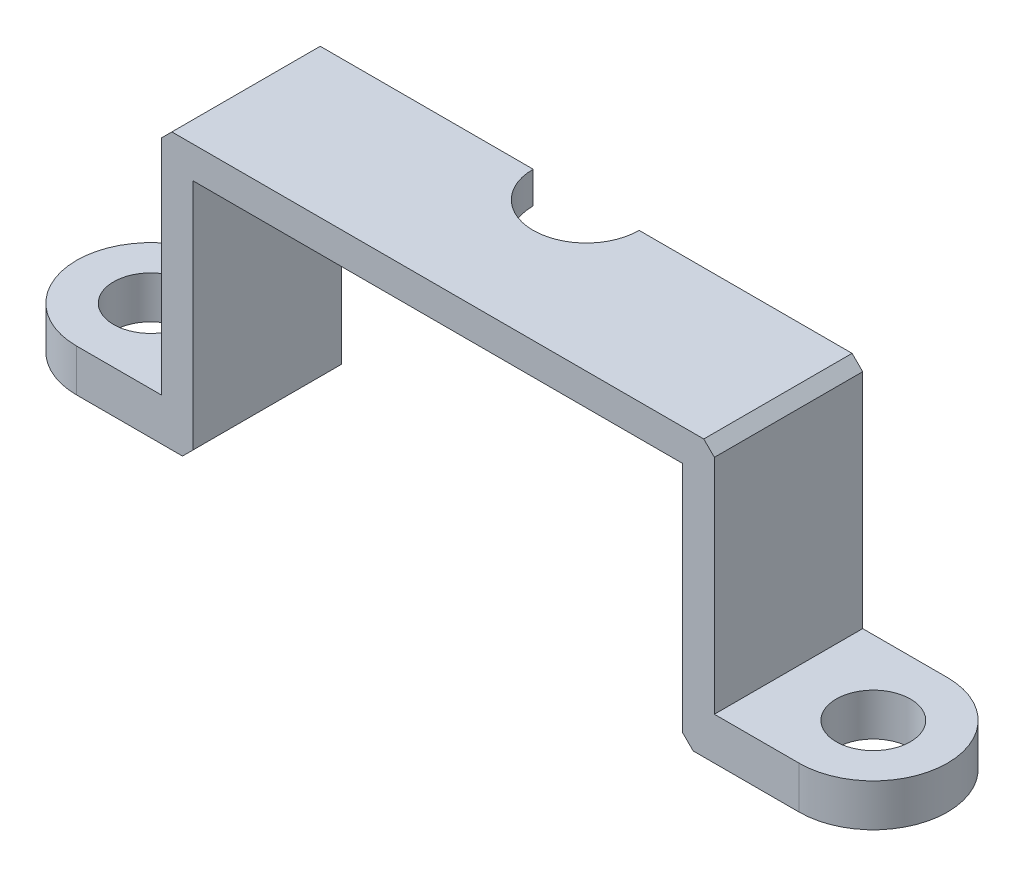
ISO-10303-21;
HEADER;
FILE_DESCRIPTION(('STEP AP214'),'2;1');
FILE_NAME('part.step','',(''),(''),'','','');
FILE_SCHEMA(('AUTOMOTIVE_DESIGN { 1 0 10303 214 1 1 1 1 }'));
ENDSEC;
DATA;
#1=APPLICATION_CONTEXT('core data for automotive mechanical design processes');
#2=APPLICATION_PROTOCOL_DEFINITION('international standard','automotive_design',2000,#1);
#3=PRODUCT_CONTEXT('',#1,'mechanical');
#4=PRODUCT('Part','Part','',(#3));
#5=PRODUCT_RELATED_PRODUCT_CATEGORY('part','',(#4));
#6=PRODUCT_DEFINITION_FORMATION('','',#4);
#7=PRODUCT_DEFINITION_CONTEXT('part definition',#1,'design');
#8=PRODUCT_DEFINITION('design','',#6,#7);
#9=PRODUCT_DEFINITION_SHAPE('','',#8);
#10=(LENGTH_UNIT() NAMED_UNIT(*) SI_UNIT(.MILLI.,.METRE.));
#11=(NAMED_UNIT(*) PLANE_ANGLE_UNIT() SI_UNIT($,.RADIAN.));
#12=(NAMED_UNIT(*) SI_UNIT($,.STERADIAN.) SOLID_ANGLE_UNIT());
#13=UNCERTAINTY_MEASURE_WITH_UNIT(LENGTH_MEASURE(1.E-05),#10,'distance_accuracy_value','');
#14=(GEOMETRIC_REPRESENTATION_CONTEXT(3) GLOBAL_UNCERTAINTY_ASSIGNED_CONTEXT((#13)) GLOBAL_UNIT_ASSIGNED_CONTEXT((#10,
#11,#12)) REPRESENTATION_CONTEXT('',''));
#15=CARTESIAN_POINT('',(0.,0.,0.));
#16=DIRECTION('',(0.,0.,1.));
#17=DIRECTION('',(1.,0.,0.));
#18=AXIS2_PLACEMENT_3D('',#15,#16,#17);
#19=CARTESIAN_POINT('',(0.,0.,0.));
#20=DIRECTION('',(0.,0.,1.));
#21=DIRECTION('',(1.,0.,0.));
#22=AXIS2_PLACEMENT_3D('',#19,#20,#21);
#23=PLANE('',#22);
#24=DIRECTION('',(1.,0.,0.));
#25=VECTOR('',#24,1.);
#26=CARTESIAN_POINT('',(0.,11.5,0.));
#27=LINE('',#26,#25);
#28=CARTESIAN_POINT('',(2.5,11.5,0.));
#29=VERTEX_POINT('',#28);
#30=CARTESIAN_POINT('',(11.55,11.5,0.));
#31=VERTEX_POINT('',#30);
#32=EDGE_CURVE('E175',#29,#31,#27,.T.);
#33=ORIENTED_EDGE('',*,*,#32,.F.);
#34=DIRECTION('',(0.,1.,0.));
#35=VECTOR('',#34,1.);
#36=CARTESIAN_POINT('',(2.5,0.,0.));
#37=LINE('',#36,#35);
#38=CARTESIAN_POINT('',(2.5,13.,0.));
#39=VERTEX_POINT('',#38);
#40=EDGE_CURVE('E11',#29,#39,#37,.T.);
#41=ORIENTED_EDGE('',*,*,#40,.T.);
#42=DIRECTION('',(-1.,0.,0.));
#43=VECTOR('',#42,1.);
#44=CARTESIAN_POINT('',(13.05,13.,0.));
#45=LINE('',#44,#43);
#46=CARTESIAN_POINT('',(12.55,13.,0.));
#47=VERTEX_POINT('',#46);
#48=EDGE_CURVE('E173',#47,#39,#45,.T.);
#49=ORIENTED_EDGE('',*,*,#48,.F.);
#50=DIRECTION('',(-0.707106781186546,0.707106781186549,0.));
#51=VECTOR('',#50,1.);
#52=CARTESIAN_POINT('',(12.55,13.,0.));
#53=LINE('',#52,#51);
#54=CARTESIAN_POINT('',(13.05,12.5,0.));
#55=VERTEX_POINT('',#54);
#56=EDGE_CURVE('E204',#47,#55,#53,.F.);
#57=ORIENTED_EDGE('',*,*,#56,.T.);
#58=DIRECTION('',(0.,1.,0.));
#59=VECTOR('',#58,1.);
#60=CARTESIAN_POINT('',(13.05,2.,0.));
#61=LINE('',#60,#59);
#62=CARTESIAN_POINT('',(13.05,2.,0.));
#63=VERTEX_POINT('',#62);
#64=EDGE_CURVE('E185',#63,#55,#61,.T.);
#65=ORIENTED_EDGE('',*,*,#64,.F.);
#66=DIRECTION('',(-1.,0.,0.));
#67=VECTOR('',#66,1.);
#68=CARTESIAN_POINT('',(21.05,2.,0.));
#69=LINE('',#68,#67);
#70=CARTESIAN_POINT('',(17.05,2.,0.));
#71=VERTEX_POINT('',#70);
#72=EDGE_CURVE('E295',#71,#63,#69,.T.);
#73=ORIENTED_EDGE('',*,*,#72,.F.);
#74=DIRECTION('',(0.,1.,0.));
#75=VECTOR('',#74,1.);
#76=CARTESIAN_POINT('',(17.05,0.,0.));
#77=LINE('',#76,#75);
#78=CARTESIAN_POINT('',(17.05,0.,0.));
#79=VERTEX_POINT('',#78);
#80=EDGE_CURVE('E246',#79,#71,#77,.T.);
#81=ORIENTED_EDGE('',*,*,#80,.F.);
#82=DIRECTION('',(1.,0.,0.));
#83=VECTOR('',#82,1.);
#84=CARTESIAN_POINT('',(11.55,0.,0.));
#85=LINE('',#84,#83);
#86=CARTESIAN_POINT('',(12.05,0.,0.));
#87=VERTEX_POINT('',#86);
#88=EDGE_CURVE('E280',#87,#79,#85,.T.);
#89=ORIENTED_EDGE('',*,*,#88,.F.);
#90=DIRECTION('',(0.707106781186545,-0.70710678118655,0.));
#91=VECTOR('',#90,1.);
#92=CARTESIAN_POINT('',(12.05,0.,0.));
#93=LINE('',#92,#91);
#94=CARTESIAN_POINT('',(11.55,0.5,0.));
#95=VERTEX_POINT('',#94);
#96=EDGE_CURVE('E202',#87,#95,#93,.F.);
#97=ORIENTED_EDGE('',*,*,#96,.T.);
#98=DIRECTION('',(0.,-1.,0.));
#99=VECTOR('',#98,1.);
#100=CARTESIAN_POINT('',(11.55,11.5,0.));
#101=LINE('',#100,#99);
#102=EDGE_CURVE('E190',#31,#95,#101,.T.);
#103=ORIENTED_EDGE('',*,*,#102,.F.);
#104=EDGE_LOOP('',(#33,#41,#49,#57,#65,#73,#81,#89,#97,#103));
#105=FACE_BOUND('',#104,.T.);
#106=ADVANCED_FACE('F38',(#105),#23,.F.);
#107=CARTESIAN_POINT('',(11.55,0.,7.));
#108=DIRECTION('',(0.,1.,0.));
#109=DIRECTION('',(0.,0.,1.));
#110=AXIS2_PLACEMENT_3D('',#107,#108,#109);
#111=PLANE('',#110);
#112=CARTESIAN_POINT('',(17.05,0.,3.5));
#113=DIRECTION('',(0.,1.,0.));
#114=DIRECTION('',(-1.,0.,0.));
#115=AXIS2_PLACEMENT_3D('',#112,#113,#114);
#116=CIRCLE('',#115,1.75);
#117=CARTESIAN_POINT('',(15.3,0.,3.5));
#118=VERTEX_POINT('',#117);
#119=EDGE_CURVE('E277',#118,#118,#116,.T.);
#120=ORIENTED_EDGE('',*,*,#119,.T.);
#121=EDGE_LOOP('',(#120));
#122=FACE_BOUND('',#121,.T.);
#123=DIRECTION('',(1.,0.,0.));
#124=VECTOR('',#123,1.);
#125=CARTESIAN_POINT('',(11.55,0.,7.));
#126=LINE('',#125,#124);
#127=CARTESIAN_POINT('',(12.05,0.,7.));
#128=VERTEX_POINT('',#127);
#129=CARTESIAN_POINT('',(17.05,0.,7.));
#130=VERTEX_POINT('',#129);
#131=EDGE_CURVE('E193',#128,#130,#126,.T.);
#132=ORIENTED_EDGE('',*,*,#131,.F.);
#133=DIRECTION('',(0.,0.,-1.));
#134=VECTOR('',#133,1.);
#135=CARTESIAN_POINT('',(12.05,0.,7.));
#136=LINE('',#135,#134);
#137=EDGE_CURVE('E212',#128,#87,#136,.T.);
#138=ORIENTED_EDGE('',*,*,#137,.T.);
#139=ORIENTED_EDGE('',*,*,#88,.T.);
#140=CARTESIAN_POINT('',(17.05,0.,3.5));
#141=DIRECTION('',(0.,-1.,0.));
#142=DIRECTION('',(-1.,0.,0.));
#143=AXIS2_PLACEMENT_3D('',#140,#141,#142);
#144=CIRCLE('',#143,3.5);
#145=EDGE_CURVE('E270',#79,#130,#144,.T.);
#146=ORIENTED_EDGE('',*,*,#145,.T.);
#147=EDGE_LOOP('',(#132,#138,#139,#146));
#148=FACE_BOUND('',#147,.T.);
#149=ADVANCED_FACE('F364',(#122,#148),#111,.F.);
#150=CARTESIAN_POINT('',(21.05,2.,7.));
#151=DIRECTION('',(0.,-1.,0.));
#152=DIRECTION('',(1.,0.,0.));
#153=AXIS2_PLACEMENT_3D('',#150,#151,#152);
#154=PLANE('',#153);
#155=CARTESIAN_POINT('',(17.05,2.,3.5));
#156=DIRECTION('',(0.,1.,0.));
#157=DIRECTION('',(-1.,0.,0.));
#158=AXIS2_PLACEMENT_3D('',#155,#156,#157);
#159=CIRCLE('',#158,1.75);
#160=CARTESIAN_POINT('',(15.3,2.,3.5));
#161=VERTEX_POINT('',#160);
#162=EDGE_CURVE('E274',#161,#161,#159,.T.);
#163=ORIENTED_EDGE('',*,*,#162,.F.);
#164=EDGE_LOOP('',(#163));
#165=FACE_BOUND('',#164,.T.);
#166=DIRECTION('',(-1.,0.,0.));
#167=VECTOR('',#166,1.);
#168=CARTESIAN_POINT('',(21.05,2.,7.));
#169=LINE('',#168,#167);
#170=CARTESIAN_POINT('',(17.05,2.,7.));
#171=VERTEX_POINT('',#170);
#172=CARTESIAN_POINT('',(13.05,2.,7.));
#173=VERTEX_POINT('',#172);
#174=EDGE_CURVE('E284',#171,#173,#169,.T.);
#175=ORIENTED_EDGE('',*,*,#174,.F.);
#176=CARTESIAN_POINT('',(17.05,2.,3.5));
#177=DIRECTION('',(0.,-1.,0.));
#178=DIRECTION('',(-1.,0.,0.));
#179=AXIS2_PLACEMENT_3D('',#176,#177,#178);
#180=CIRCLE('',#179,3.5);
#181=EDGE_CURVE('E272',#71,#171,#180,.T.);
#182=ORIENTED_EDGE('',*,*,#181,.F.);
#183=ORIENTED_EDGE('',*,*,#72,.T.);
#184=DIRECTION('',(0.,0.,-1.));
#185=VECTOR('',#184,1.);
#186=CARTESIAN_POINT('',(13.05,2.,7.));
#187=LINE('',#186,#185);
#188=EDGE_CURVE('E197',#173,#63,#187,.T.);
#189=ORIENTED_EDGE('',*,*,#188,.F.);
#190=EDGE_LOOP('',(#175,#182,#183,#189));
#191=FACE_BOUND('',#190,.T.);
#192=ADVANCED_FACE('F369',(#165,#191),#154,.F.);
#193=CARTESIAN_POINT('',(13.05,2.,7.));
#194=DIRECTION('',(-1.,0.,0.));
#195=DIRECTION('',(0.,0.,1.));
#196=AXIS2_PLACEMENT_3D('',#193,#194,#195);
#197=PLANE('',#196);
#198=ORIENTED_EDGE('',*,*,#64,.T.);
#199=DIRECTION('',(0.,0.,1.));
#200=VECTOR('',#199,1.);
#201=CARTESIAN_POINT('',(13.05,12.5,7.));
#202=LINE('',#201,#200);
#203=CARTESIAN_POINT('',(13.05,12.5,7.));
#204=VERTEX_POINT('',#203);
#205=EDGE_CURVE('E206',#55,#204,#202,.T.);
#206=ORIENTED_EDGE('',*,*,#205,.T.);
#207=DIRECTION('',(0.,1.,0.));
#208=VECTOR('',#207,1.);
#209=CARTESIAN_POINT('',(13.05,2.,7.));
#210=LINE('',#209,#208);
#211=EDGE_CURVE('E286',#173,#204,#210,.T.);
#212=ORIENTED_EDGE('',*,*,#211,.F.);
#213=ORIENTED_EDGE('',*,*,#188,.T.);
#214=EDGE_LOOP('',(#198,#206,#212,#213));
#215=FACE_BOUND('',#214,.T.);
#216=ADVANCED_FACE('F304',(#215),#197,.F.);
#217=CARTESIAN_POINT('',(13.05,13.,7.));
#218=DIRECTION('',(0.,-1.,0.));
#219=DIRECTION('',(1.,0.,0.));
#220=AXIS2_PLACEMENT_3D('',#217,#218,#219);
#221=PLANE('',#220);
#222=ORIENTED_EDGE('',*,*,#48,.T.);
#223=CARTESIAN_POINT('',(0.,13.,0.));
#224=DIRECTION('',(0.,1.,0.));
#225=DIRECTION('',(-1.,0.,0.));
#226=AXIS2_PLACEMENT_3D('',#223,#224,#225);
#227=CIRCLE('',#226,2.5);
#228=CARTESIAN_POINT('',(-2.5,13.,0.));
#229=VERTEX_POINT('',#228);
#230=EDGE_CURVE('E164',#229,#39,#227,.T.);
#231=ORIENTED_EDGE('',*,*,#230,.F.);
#232=CARTESIAN_POINT('',(-12.55,13.,0.));
#233=VERTEX_POINT('',#232);
#234=EDGE_CURVE('E181',#229,#233,#45,.T.);
#235=ORIENTED_EDGE('',*,*,#234,.T.);
#236=DIRECTION('',(0.,0.,1.));
#237=VECTOR('',#236,1.);
#238=CARTESIAN_POINT('',(-12.55,13.,7.));
#239=LINE('',#238,#237);
#240=CARTESIAN_POINT('',(-12.55,13.,7.));
#241=VERTEX_POINT('',#240);
#242=EDGE_CURVE('E225',#233,#241,#239,.T.);
#243=ORIENTED_EDGE('',*,*,#242,.T.);
#244=DIRECTION('',(-1.,0.,0.));
#245=VECTOR('',#244,1.);
#246=CARTESIAN_POINT('',(13.05,13.,7.));
#247=LINE('',#246,#245);
#248=CARTESIAN_POINT('',(12.55,13.,7.));
#249=VERTEX_POINT('',#248);
#250=EDGE_CURVE('E289',#249,#241,#247,.T.);
#251=ORIENTED_EDGE('',*,*,#250,.F.);
#252=DIRECTION('',(0.,0.,-1.));
#253=VECTOR('',#252,1.);
#254=CARTESIAN_POINT('',(12.55,13.,7.));
#255=LINE('',#254,#253);
#256=EDGE_CURVE('E180',#249,#47,#255,.T.);
#257=ORIENTED_EDGE('',*,*,#256,.T.);
#258=EDGE_LOOP('',(#222,#231,#235,#243,#251,#257));
#259=FACE_BOUND('',#258,.T.);
#260=ADVANCED_FACE('F177',(#259),#221,.F.);
#261=CARTESIAN_POINT('',(0.,11.5,7.));
#262=DIRECTION('',(0.,1.,0.));
#263=DIRECTION('',(0.,0.,1.));
#264=AXIS2_PLACEMENT_3D('',#261,#262,#263);
#265=PLANE('',#264);
#266=CARTESIAN_POINT('',(-11.55,11.5,0.));
#267=VERTEX_POINT('',#266);
#268=CARTESIAN_POINT('',(-2.5,11.5,0.));
#269=VERTEX_POINT('',#268);
#270=EDGE_CURVE('E183',#267,#269,#27,.T.);
#271=ORIENTED_EDGE('',*,*,#270,.T.);
#272=CARTESIAN_POINT('',(0.,11.5,0.));
#273=DIRECTION('',(0.,1.,0.));
#274=DIRECTION('',(0.,0.,1.));
#275=AXIS2_PLACEMENT_3D('',#272,#273,#274);
#276=CIRCLE('',#275,2.5);
#277=EDGE_CURVE('E54',#269,#29,#276,.T.);
#278=ORIENTED_EDGE('',*,*,#277,.T.);
#279=ORIENTED_EDGE('',*,*,#32,.T.);
#280=DIRECTION('',(0.,0.,-1.));
#281=VECTOR('',#280,1.);
#282=CARTESIAN_POINT('',(11.55,11.5,7.));
#283=LINE('',#282,#281);
#284=CARTESIAN_POINT('',(11.55,11.5,7.));
#285=VERTEX_POINT('',#284);
#286=EDGE_CURVE('E194',#285,#31,#283,.T.);
#287=ORIENTED_EDGE('',*,*,#286,.F.);
#288=DIRECTION('',(1.,0.,0.));
#289=VECTOR('',#288,1.);
#290=CARTESIAN_POINT('',(0.,11.5,7.));
#291=LINE('',#290,#289);
#292=CARTESIAN_POINT('',(-11.55,11.5,7.));
#293=VERTEX_POINT('',#292);
#294=EDGE_CURVE('E244',#293,#285,#291,.T.);
#295=ORIENTED_EDGE('',*,*,#294,.F.);
#296=DIRECTION('',(0.,0.,-1.));
#297=VECTOR('',#296,1.);
#298=CARTESIAN_POINT('',(-11.55,11.5,7.));
#299=LINE('',#298,#297);
#300=EDGE_CURVE('E241',#293,#267,#299,.T.);
#301=ORIENTED_EDGE('',*,*,#300,.T.);
#302=EDGE_LOOP('',(#271,#278,#279,#287,#295,#301));
#303=FACE_BOUND('',#302,.T.);
#304=ADVANCED_FACE('F239',(#303),#265,.F.);
#305=CARTESIAN_POINT('',(11.55,11.5,7.));
#306=DIRECTION('',(1.,0.,0.));
#307=DIRECTION('',(0.,1.,0.));
#308=AXIS2_PLACEMENT_3D('',#305,#306,#307);
#309=PLANE('',#308);
#310=ORIENTED_EDGE('',*,*,#102,.T.);
#311=DIRECTION('',(0.,0.,1.));
#312=VECTOR('',#311,1.);
#313=CARTESIAN_POINT('',(11.55,0.5,7.));
#314=LINE('',#313,#312);
#315=CARTESIAN_POINT('',(11.55,0.5,7.));
#316=VERTEX_POINT('',#315);
#317=EDGE_CURVE('E215',#95,#316,#314,.T.);
#318=ORIENTED_EDGE('',*,*,#317,.T.);
#319=DIRECTION('',(0.,-1.,0.));
#320=VECTOR('',#319,1.);
#321=CARTESIAN_POINT('',(11.55,11.5,7.));
#322=LINE('',#321,#320);
#323=EDGE_CURVE('E198',#285,#316,#322,.T.);
#324=ORIENTED_EDGE('',*,*,#323,.F.);
#325=ORIENTED_EDGE('',*,*,#286,.T.);
#326=EDGE_LOOP('',(#310,#318,#324,#325));
#327=FACE_BOUND('',#326,.T.);
#328=ADVANCED_FACE('F383',(#327),#309,.F.);
#329=CARTESIAN_POINT('',(0.,0.,7.));
#330=DIRECTION('',(0.,0.,1.));
#331=DIRECTION('',(1.,0.,0.));
#332=AXIS2_PLACEMENT_3D('',#329,#330,#331);
#333=PLANE('',#332);
#334=ORIENTED_EDGE('',*,*,#250,.T.);
#335=DIRECTION('',(-0.707106781186546,-0.707106781186549,0.));
#336=VECTOR('',#335,1.);
#337=CARTESIAN_POINT('',(-12.775,12.775,7.));
#338=LINE('',#337,#336);
#339=CARTESIAN_POINT('',(-13.05,12.5,7.));
#340=VERTEX_POINT('',#339);
#341=EDGE_CURVE('E228',#241,#340,#338,.T.);
#342=ORIENTED_EDGE('',*,*,#341,.T.);
#343=DIRECTION('',(0.,1.,0.));
#344=VECTOR('',#343,1.);
#345=CARTESIAN_POINT('',(-13.05,2.,7.));
#346=LINE('',#345,#344);
#347=CARTESIAN_POINT('',(-13.05,2.,7.));
#348=VERTEX_POINT('',#347);
#349=EDGE_CURVE('E318',#348,#340,#346,.T.);
#350=ORIENTED_EDGE('',*,*,#349,.F.);
#351=DIRECTION('',(1.,0.,0.));
#352=VECTOR('',#351,1.);
#353=CARTESIAN_POINT('',(-21.05,2.,7.));
#354=LINE('',#353,#352);
#355=CARTESIAN_POINT('',(-17.05,2.,7.));
#356=VERTEX_POINT('',#355);
#357=EDGE_CURVE('E265',#356,#348,#354,.T.);
#358=ORIENTED_EDGE('',*,*,#357,.F.);
#359=DIRECTION('',(0.,1.,0.));
#360=VECTOR('',#359,1.);
#361=CARTESIAN_POINT('',(-17.05,0.,7.));
#362=LINE('',#361,#360);
#363=CARTESIAN_POINT('',(-17.05,0.,7.));
#364=VERTEX_POINT('',#363);
#365=EDGE_CURVE('E331',#364,#356,#362,.T.);
#366=ORIENTED_EDGE('',*,*,#365,.F.);
#367=DIRECTION('',(-1.,0.,0.));
#368=VECTOR('',#367,1.);
#369=CARTESIAN_POINT('',(-11.55,0.,7.));
#370=LINE('',#369,#368);
#371=CARTESIAN_POINT('',(-12.05,0.,7.));
#372=VERTEX_POINT('',#371);
#373=EDGE_CURVE('E263',#372,#364,#370,.T.);
#374=ORIENTED_EDGE('',*,*,#373,.F.);
#375=DIRECTION('',(-0.707106781186545,-0.70710678118655,0.));
#376=VECTOR('',#375,1.);
#377=CARTESIAN_POINT('',(-6.02500000000004,6.025,7.));
#378=LINE('',#377,#376);
#379=CARTESIAN_POINT('',(-11.55,0.500000000000004,7.));
#380=VERTEX_POINT('',#379);
#381=EDGE_CURVE('E62',#372,#380,#378,.F.);
#382=ORIENTED_EDGE('',*,*,#381,.T.);
#383=DIRECTION('',(0.,-1.,0.));
#384=VECTOR('',#383,1.);
#385=CARTESIAN_POINT('',(-11.55,11.5,7.));
#386=LINE('',#385,#384);
#387=EDGE_CURVE('E323',#293,#380,#386,.T.);
#388=ORIENTED_EDGE('',*,*,#387,.F.);
#389=ORIENTED_EDGE('',*,*,#294,.T.);
#390=ORIENTED_EDGE('',*,*,#323,.T.);
#391=DIRECTION('',(-0.707106781186545,0.70710678118655,0.));
#392=VECTOR('',#391,1.);
#393=CARTESIAN_POINT('',(6.02500000000004,6.025,7.));
#394=LINE('',#393,#392);
#395=EDGE_CURVE('E208',#316,#128,#394,.F.);
#396=ORIENTED_EDGE('',*,*,#395,.T.);
#397=ORIENTED_EDGE('',*,*,#131,.T.);
#398=DIRECTION('',(0.,1.,0.));
#399=VECTOR('',#398,1.);
#400=CARTESIAN_POINT('',(17.05,0.,7.));
#401=LINE('',#400,#399);
#402=EDGE_CURVE('E267',#130,#171,#401,.T.);
#403=ORIENTED_EDGE('',*,*,#402,.T.);
#404=ORIENTED_EDGE('',*,*,#174,.T.);
#405=ORIENTED_EDGE('',*,*,#211,.T.);
#406=DIRECTION('',(0.707106781186546,-0.707106781186549,0.));
#407=VECTOR('',#406,1.);
#408=CARTESIAN_POINT('',(12.775,12.775,7.));
#409=LINE('',#408,#407);
#410=EDGE_CURVE('E210',#204,#249,#409,.F.);
#411=ORIENTED_EDGE('',*,*,#410,.T.);
#412=EDGE_LOOP('',(#334,#342,#350,#358,#366,#374,#382,#388,#389,#390,#396,#397,#403,#404,#405,#411));
#413=FACE_BOUND('',#412,.T.);
#414=ADVANCED_FACE('F309',(#413),#333,.T.);
#415=ORIENTED_EDGE('',*,*,#234,.F.);
#416=DIRECTION('',(0.,1.,0.));
#417=VECTOR('',#416,1.);
#418=CARTESIAN_POINT('',(-2.5,0.,0.));
#419=LINE('',#418,#417);
#420=EDGE_CURVE('E47',#229,#269,#419,.F.);
#421=ORIENTED_EDGE('',*,*,#420,.T.);
#422=ORIENTED_EDGE('',*,*,#270,.F.);
#423=DIRECTION('',(0.,-1.,0.));
#424=VECTOR('',#423,1.);
#425=CARTESIAN_POINT('',(-11.55,11.5,0.));
#426=LINE('',#425,#424);
#427=CARTESIAN_POINT('',(-11.55,0.500000000000004,0.));
#428=VERTEX_POINT('',#427);
#429=EDGE_CURVE('E249',#267,#428,#426,.T.);
#430=ORIENTED_EDGE('',*,*,#429,.T.);
#431=DIRECTION('',(0.707106781186545,0.70710678118655,0.));
#432=VECTOR('',#431,1.);
#433=CARTESIAN_POINT('',(-11.55,0.500000000000004,0.));
#434=LINE('',#433,#432);
#435=CARTESIAN_POINT('',(-12.05,0.,0.));
#436=VERTEX_POINT('',#435);
#437=EDGE_CURVE('E220',#428,#436,#434,.F.);
#438=ORIENTED_EDGE('',*,*,#437,.T.);
#439=DIRECTION('',(-1.,0.,0.));
#440=VECTOR('',#439,1.);
#441=CARTESIAN_POINT('',(-11.55,0.,0.));
#442=LINE('',#441,#440);
#443=CARTESIAN_POINT('',(-17.05,0.,0.));
#444=VERTEX_POINT('',#443);
#445=EDGE_CURVE('E253',#436,#444,#442,.T.);
#446=ORIENTED_EDGE('',*,*,#445,.T.);
#447=DIRECTION('',(0.,1.,0.));
#448=VECTOR('',#447,1.);
#449=CARTESIAN_POINT('',(-17.05,0.,0.));
#450=LINE('',#449,#448);
#451=CARTESIAN_POINT('',(-17.05,2.,0.));
#452=VERTEX_POINT('',#451);
#453=EDGE_CURVE('E334',#444,#452,#450,.T.);
#454=ORIENTED_EDGE('',*,*,#453,.T.);
#455=DIRECTION('',(1.,0.,0.));
#456=VECTOR('',#455,1.);
#457=CARTESIAN_POINT('',(-21.05,2.,0.));
#458=LINE('',#457,#456);
#459=CARTESIAN_POINT('',(-13.05,2.,0.));
#460=VERTEX_POINT('',#459);
#461=EDGE_CURVE('E256',#452,#460,#458,.T.);
#462=ORIENTED_EDGE('',*,*,#461,.T.);
#463=DIRECTION('',(0.,1.,0.));
#464=VECTOR('',#463,1.);
#465=CARTESIAN_POINT('',(-13.05,2.,0.));
#466=LINE('',#465,#464);
#467=CARTESIAN_POINT('',(-13.05,12.5,0.));
#468=VERTEX_POINT('',#467);
#469=EDGE_CURVE('E252',#460,#468,#466,.T.);
#470=ORIENTED_EDGE('',*,*,#469,.T.);
#471=DIRECTION('',(0.707106781186546,0.707106781186549,0.));
#472=VECTOR('',#471,1.);
#473=CARTESIAN_POINT('',(-13.05,12.5,0.));
#474=LINE('',#473,#472);
#475=EDGE_CURVE('E222',#468,#233,#474,.T.);
#476=ORIENTED_EDGE('',*,*,#475,.T.);
#477=EDGE_LOOP('',(#415,#421,#422,#430,#438,#446,#454,#462,#470,#476));
#478=FACE_BOUND('',#477,.T.);
#479=ADVANCED_FACE('F235',(#478),#23,.F.);
#480=CARTESIAN_POINT('',(17.05,0.,3.5));
#481=DIRECTION('',(0.,1.,0.));
#482=DIRECTION('',(-1.,0.,0.));
#483=AXIS2_PLACEMENT_3D('',#480,#481,#482);
#484=CYLINDRICAL_SURFACE('',#483,3.5);
#485=ORIENTED_EDGE('',*,*,#181,.T.);
#486=ORIENTED_EDGE('',*,*,#402,.F.);
#487=ORIENTED_EDGE('',*,*,#145,.F.);
#488=ORIENTED_EDGE('',*,*,#80,.T.);
#489=EDGE_LOOP('',(#485,#486,#487,#488));
#490=FACE_BOUND('',#489,.T.);
#491=ADVANCED_FACE('F375',(#490),#484,.T.);
#492=CARTESIAN_POINT('',(17.05,0.,3.5));
#493=DIRECTION('',(0.,1.,0.));
#494=DIRECTION('',(-1.,0.,0.));
#495=AXIS2_PLACEMENT_3D('',#492,#493,#494);
#496=CYLINDRICAL_SURFACE('',#495,1.75);
#497=ORIENTED_EDGE('',*,*,#119,.F.);
#498=EDGE_LOOP('',(#497));
#499=FACE_BOUND('',#498,.T.);
#500=ORIENTED_EDGE('',*,*,#162,.T.);
#501=EDGE_LOOP('',(#500));
#502=FACE_BOUND('',#501,.T.);
#503=ADVANCED_FACE('F380',(#499,#502),#496,.F.);
#504=CARTESIAN_POINT('',(12.55,13.,7.));
#505=DIRECTION('',(-0.707106781186549,-0.707106781186546,0.));
#506=DIRECTION('',(0.,0.,-1.));
#507=AXIS2_PLACEMENT_3D('',#504,#505,#506);
#508=PLANE('',#507);
#509=ORIENTED_EDGE('',*,*,#410,.F.);
#510=ORIENTED_EDGE('',*,*,#205,.F.);
#511=ORIENTED_EDGE('',*,*,#56,.F.);
#512=ORIENTED_EDGE('',*,*,#256,.F.);
#513=EDGE_LOOP('',(#509,#510,#511,#512));
#514=FACE_BOUND('',#513,.T.);
#515=ADVANCED_FACE('F308',(#514),#508,.F.);
#516=CARTESIAN_POINT('',(12.05,0.,7.));
#517=DIRECTION('',(0.70710678118655,0.707106781186545,0.));
#518=DIRECTION('',(0.,0.,-1.));
#519=AXIS2_PLACEMENT_3D('',#516,#517,#518);
#520=PLANE('',#519);
#521=ORIENTED_EDGE('',*,*,#395,.F.);
#522=ORIENTED_EDGE('',*,*,#317,.F.);
#523=ORIENTED_EDGE('',*,*,#96,.F.);
#524=ORIENTED_EDGE('',*,*,#137,.F.);
#525=EDGE_LOOP('',(#521,#522,#523,#524));
#526=FACE_BOUND('',#525,.T.);
#527=ADVANCED_FACE('F394',(#526),#520,.F.);
#528=CARTESIAN_POINT('',(-11.55,0.,7.));
#529=DIRECTION('',(0.,-1.,0.));
#530=DIRECTION('',(0.,0.,-1.));
#531=AXIS2_PLACEMENT_3D('',#528,#529,#530);
#532=PLANE('',#531);
#533=CARTESIAN_POINT('',(-17.05,0.,3.5));
#534=DIRECTION('',(0.,-1.,0.));
#535=DIRECTION('',(1.,0.,0.));
#536=AXIS2_PLACEMENT_3D('',#533,#534,#535);
#537=CIRCLE('',#536,1.75);
#538=CARTESIAN_POINT('',(-15.3,0.,3.5));
#539=VERTEX_POINT('',#538);
#540=EDGE_CURVE('E258',#539,#539,#537,.T.);
#541=ORIENTED_EDGE('',*,*,#540,.F.);
#542=EDGE_LOOP('',(#541));
#543=FACE_BOUND('',#542,.T.);
#544=ORIENTED_EDGE('',*,*,#445,.F.);
#545=DIRECTION('',(0.,0.,1.));
#546=VECTOR('',#545,1.);
#547=CARTESIAN_POINT('',(-12.05,0.,7.));
#548=LINE('',#547,#546);
#549=EDGE_CURVE('E233',#436,#372,#548,.T.);
#550=ORIENTED_EDGE('',*,*,#549,.T.);
#551=ORIENTED_EDGE('',*,*,#373,.T.);
#552=CARTESIAN_POINT('',(-17.05,0.,3.5));
#553=DIRECTION('',(0.,1.,0.));
#554=DIRECTION('',(1.,0.,0.));
#555=AXIS2_PLACEMENT_3D('',#552,#553,#554);
#556=CIRCLE('',#555,3.5);
#557=EDGE_CURVE('E337',#444,#364,#556,.T.);
#558=ORIENTED_EDGE('',*,*,#557,.F.);
#559=EDGE_LOOP('',(#544,#550,#551,#558));
#560=FACE_BOUND('',#559,.T.);
#561=ADVANCED_FACE('F355',(#543,#560),#532,.T.);
#562=CARTESIAN_POINT('',(-11.55,11.5,7.));
#563=DIRECTION('',(1.,0.,0.));
#564=DIRECTION('',(0.,1.,0.));
#565=AXIS2_PLACEMENT_3D('',#562,#563,#564);
#566=PLANE('',#565);
#567=ORIENTED_EDGE('',*,*,#387,.T.);
#568=DIRECTION('',(0.,0.,-1.));
#569=VECTOR('',#568,1.);
#570=CARTESIAN_POINT('',(-11.55,0.500000000000004,7.));
#571=LINE('',#570,#569);
#572=EDGE_CURVE('E230',#380,#428,#571,.T.);
#573=ORIENTED_EDGE('',*,*,#572,.T.);
#574=ORIENTED_EDGE('',*,*,#429,.F.);
#575=ORIENTED_EDGE('',*,*,#300,.F.);
#576=EDGE_LOOP('',(#567,#573,#574,#575));
#577=FACE_BOUND('',#576,.T.);
#578=ADVANCED_FACE('F250',(#577),#566,.T.);
#579=CARTESIAN_POINT('',(-13.05,2.,7.));
#580=DIRECTION('',(-1.,0.,0.));
#581=DIRECTION('',(0.,0.,1.));
#582=AXIS2_PLACEMENT_3D('',#579,#580,#581);
#583=PLANE('',#582);
#584=ORIENTED_EDGE('',*,*,#349,.T.);
#585=DIRECTION('',(0.,0.,-1.));
#586=VECTOR('',#585,1.);
#587=CARTESIAN_POINT('',(-13.05,12.5,0.));
#588=LINE('',#587,#586);
#589=EDGE_CURVE('E217',#340,#468,#588,.T.);
#590=ORIENTED_EDGE('',*,*,#589,.T.);
#591=ORIENTED_EDGE('',*,*,#469,.F.);
#592=DIRECTION('',(0.,0.,-1.));
#593=VECTOR('',#592,1.);
#594=CARTESIAN_POINT('',(-13.05,2.,7.));
#595=LINE('',#594,#593);
#596=EDGE_CURVE('E247',#348,#460,#595,.T.);
#597=ORIENTED_EDGE('',*,*,#596,.F.);
#598=EDGE_LOOP('',(#584,#590,#591,#597));
#599=FACE_BOUND('',#598,.T.);
#600=ADVANCED_FACE('F321',(#599),#583,.T.);
#601=CARTESIAN_POINT('',(-21.05,2.,7.));
#602=DIRECTION('',(0.,1.,0.));
#603=DIRECTION('',(-1.,0.,0.));
#604=AXIS2_PLACEMENT_3D('',#601,#602,#603);
#605=PLANE('',#604);
#606=CARTESIAN_POINT('',(-17.05,2.,3.5));
#607=DIRECTION('',(0.,-1.,0.));
#608=DIRECTION('',(1.,0.,0.));
#609=AXIS2_PLACEMENT_3D('',#606,#607,#608);
#610=CIRCLE('',#609,1.75);
#611=CARTESIAN_POINT('',(-15.3,2.,3.5));
#612=VERTEX_POINT('',#611);
#613=EDGE_CURVE('E328',#612,#612,#610,.T.);
#614=ORIENTED_EDGE('',*,*,#613,.T.);
#615=EDGE_LOOP('',(#614));
#616=FACE_BOUND('',#615,.T.);
#617=ORIENTED_EDGE('',*,*,#461,.F.);
#618=CARTESIAN_POINT('',(-17.05,2.,3.5));
#619=DIRECTION('',(0.,1.,0.));
#620=DIRECTION('',(1.,0.,0.));
#621=AXIS2_PLACEMENT_3D('',#618,#619,#620);
#622=CIRCLE('',#621,3.5);
#623=EDGE_CURVE('E339',#452,#356,#622,.T.);
#624=ORIENTED_EDGE('',*,*,#623,.T.);
#625=ORIENTED_EDGE('',*,*,#357,.T.);
#626=ORIENTED_EDGE('',*,*,#596,.T.);
#627=EDGE_LOOP('',(#617,#624,#625,#626));
#628=FACE_BOUND('',#627,.T.);
#629=ADVANCED_FACE('F353',(#616,#628),#605,.T.);
#630=CARTESIAN_POINT('',(-17.05,0.,3.5));
#631=DIRECTION('',(0.,1.,0.));
#632=DIRECTION('',(-1.,0.,0.));
#633=AXIS2_PLACEMENT_3D('',#630,#631,#632);
#634=CYLINDRICAL_SURFACE('',#633,1.75);
#635=ORIENTED_EDGE('',*,*,#540,.T.);
#636=EDGE_LOOP('',(#635));
#637=FACE_BOUND('',#636,.T.);
#638=ORIENTED_EDGE('',*,*,#613,.F.);
#639=EDGE_LOOP('',(#638));
#640=FACE_BOUND('',#639,.T.);
#641=ADVANCED_FACE('F402',(#637,#640),#634,.F.);
#642=CARTESIAN_POINT('',(-17.05,0.,3.5));
#643=DIRECTION('',(0.,1.,0.));
#644=DIRECTION('',(-1.,0.,0.));
#645=AXIS2_PLACEMENT_3D('',#642,#643,#644);
#646=CYLINDRICAL_SURFACE('',#645,3.5);
#647=ORIENTED_EDGE('',*,*,#623,.F.);
#648=ORIENTED_EDGE('',*,*,#453,.F.);
#649=ORIENTED_EDGE('',*,*,#557,.T.);
#650=ORIENTED_EDGE('',*,*,#365,.T.);
#651=EDGE_LOOP('',(#647,#648,#649,#650));
#652=FACE_BOUND('',#651,.T.);
#653=ADVANCED_FACE('F348',(#652),#646,.T.);
#654=CARTESIAN_POINT('',(-13.05,12.5,7.));
#655=DIRECTION('',(-0.707106781186549,0.707106781186546,0.));
#656=DIRECTION('',(0.,0.,1.));
#657=AXIS2_PLACEMENT_3D('',#654,#655,#656);
#658=PLANE('',#657);
#659=ORIENTED_EDGE('',*,*,#341,.F.);
#660=ORIENTED_EDGE('',*,*,#242,.F.);
#661=ORIENTED_EDGE('',*,*,#475,.F.);
#662=ORIENTED_EDGE('',*,*,#589,.F.);
#663=EDGE_LOOP('',(#659,#660,#661,#662));
#664=FACE_BOUND('',#663,.T.);
#665=ADVANCED_FACE('F313',(#664),#658,.T.);
#666=CARTESIAN_POINT('',(-11.55,0.500000000000004,7.));
#667=DIRECTION('',(-0.70710678118655,0.707106781186545,0.));
#668=DIRECTION('',(0.,0.,-1.));
#669=AXIS2_PLACEMENT_3D('',#666,#667,#668);
#670=PLANE('',#669);
#671=ORIENTED_EDGE('',*,*,#381,.F.);
#672=ORIENTED_EDGE('',*,*,#549,.F.);
#673=ORIENTED_EDGE('',*,*,#437,.F.);
#674=ORIENTED_EDGE('',*,*,#572,.F.);
#675=EDGE_LOOP('',(#671,#672,#673,#674));
#676=FACE_BOUND('',#675,.T.);
#677=ADVANCED_FACE('F41',(#676),#670,.F.);
#678=CARTESIAN_POINT('',(0.,0.,0.));
#679=DIRECTION('',(0.,1.,0.));
#680=DIRECTION('',(-1.,0.,0.));
#681=AXIS2_PLACEMENT_3D('',#678,#679,#680);
#682=CYLINDRICAL_SURFACE('',#681,2.5);
#683=ORIENTED_EDGE('',*,*,#420,.F.);
#684=ORIENTED_EDGE('',*,*,#230,.T.);
#685=ORIENTED_EDGE('',*,*,#40,.F.);
#686=ORIENTED_EDGE('',*,*,#277,.F.);
#687=EDGE_LOOP('',(#683,#684,#685,#686));
#688=FACE_BOUND('',#687,.T.);
#689=ADVANCED_FACE('F165',(#688),#682,.F.);
#690=CLOSED_SHELL('',(#106,#149,#192,#216,#260,#304,#328,#414,#479,#491,#503,#515,#527,#561,
#578,#600,#629,#641,#653,#665,#677,#689));
#691=MANIFOLD_SOLID_BREP('B2',#690);
#692=ADVANCED_BREP_SHAPE_REPRESENTATION('',(#18,#691),#14);
#693=SHAPE_DEFINITION_REPRESENTATION(#9,#692);
ENDSEC;
END-ISO-10303-21;
